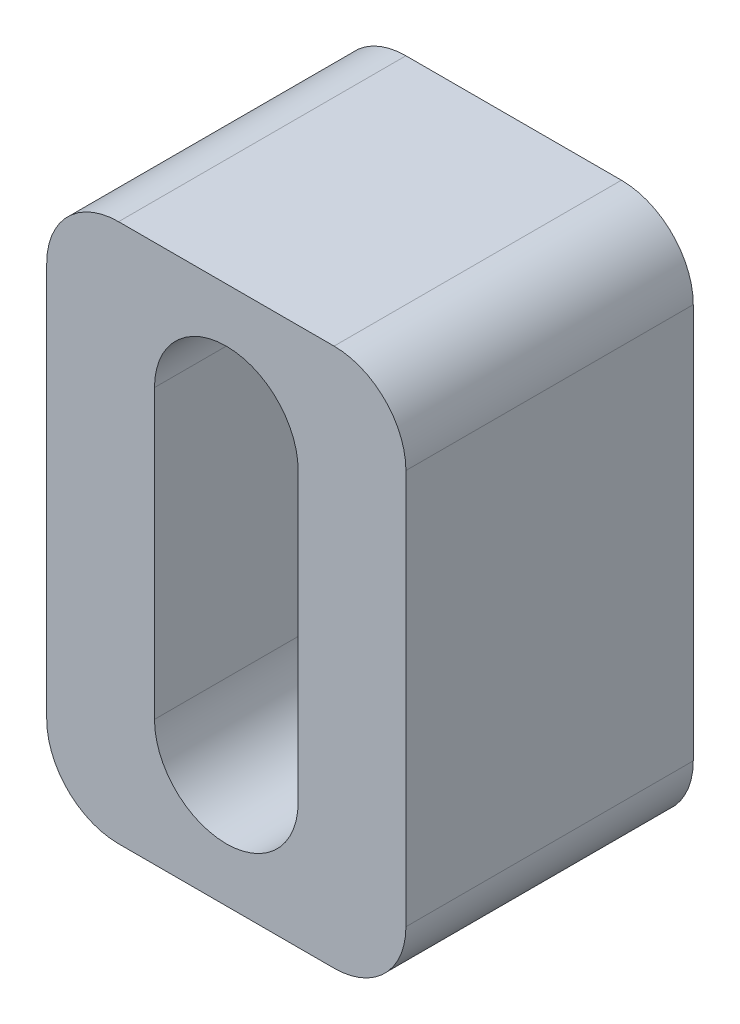
ISO-10303-21;
HEADER;
FILE_DESCRIPTION(('STEP AP214'),'2;1');
FILE_NAME('part.step','',(''),(''),'','','');
FILE_SCHEMA(('AUTOMOTIVE_DESIGN { 1 0 10303 214 1 1 1 1 }'));
ENDSEC;
DATA;
#1=APPLICATION_CONTEXT('core data for automotive mechanical design processes');
#2=APPLICATION_PROTOCOL_DEFINITION('international standard','automotive_design',2000,#1);
#3=PRODUCT_CONTEXT('',#1,'mechanical');
#4=PRODUCT('Part','Part','',(#3));
#5=PRODUCT_RELATED_PRODUCT_CATEGORY('part','',(#4));
#6=PRODUCT_DEFINITION_FORMATION('','',#4);
#7=PRODUCT_DEFINITION_CONTEXT('part definition',#1,'design');
#8=PRODUCT_DEFINITION('design','',#6,#7);
#9=PRODUCT_DEFINITION_SHAPE('','',#8);
#10=(LENGTH_UNIT() NAMED_UNIT(*) SI_UNIT(.MILLI.,.METRE.));
#11=(NAMED_UNIT(*) PLANE_ANGLE_UNIT() SI_UNIT($,.RADIAN.));
#12=(NAMED_UNIT(*) SI_UNIT($,.STERADIAN.) SOLID_ANGLE_UNIT());
#13=UNCERTAINTY_MEASURE_WITH_UNIT(LENGTH_MEASURE(1.E-05),#10,'distance_accuracy_value','');
#14=(GEOMETRIC_REPRESENTATION_CONTEXT(3) GLOBAL_UNCERTAINTY_ASSIGNED_CONTEXT((#13)) GLOBAL_UNIT_ASSIGNED_CONTEXT((#10,
#11,#12)) REPRESENTATION_CONTEXT('',''));
#15=CARTESIAN_POINT('',(0.,0.,0.));
#16=DIRECTION('',(0.,0.,1.));
#17=DIRECTION('',(1.,0.,0.));
#18=AXIS2_PLACEMENT_3D('',#15,#16,#17);
#19=CARTESIAN_POINT('',(0.,0.,8.));
#20=DIRECTION('',(0.,0.,-1.));
#21=DIRECTION('',(-1.,0.,0.));
#22=AXIS2_PLACEMENT_3D('',#19,#20,#21);
#23=PLANE('',#22);
#24=DIRECTION('',(0.,-1.,0.));
#25=VECTOR('',#24,1.);
#26=CARTESIAN_POINT('',(0.,0.,8.));
#27=LINE('',#26,#25);
#28=CARTESIAN_POINT('',(0.,13.,8.));
#29=VERTEX_POINT('',#28);
#30=CARTESIAN_POINT('',(0.,2.,8.));
#31=VERTEX_POINT('',#30);
#32=EDGE_CURVE('E165',#29,#31,#27,.T.);
#33=ORIENTED_EDGE('',*,*,#32,.T.);
#34=CARTESIAN_POINT('',(2.,2.,8.));
#35=DIRECTION('',(0.,0.,-1.));
#36=DIRECTION('',(-1.,0.,0.));
#37=AXIS2_PLACEMENT_3D('',#34,#35,#36);
#38=CIRCLE('',#37,2.);
#39=CARTESIAN_POINT('',(2.,0.,8.));
#40=VERTEX_POINT('',#39);
#41=EDGE_CURVE('E208',#31,#40,#38,.F.);
#42=ORIENTED_EDGE('',*,*,#41,.T.);
#43=DIRECTION('',(1.,0.,0.));
#44=VECTOR('',#43,1.);
#45=CARTESIAN_POINT('',(0.,0.,8.));
#46=LINE('',#45,#44);
#47=CARTESIAN_POINT('',(8.,0.,8.));
#48=VERTEX_POINT('',#47);
#49=EDGE_CURVE('E168',#40,#48,#46,.T.);
#50=ORIENTED_EDGE('',*,*,#49,.T.);
#51=CARTESIAN_POINT('',(8.,2.,8.));
#52=DIRECTION('',(0.,0.,-1.));
#53=DIRECTION('',(-1.,0.,0.));
#54=AXIS2_PLACEMENT_3D('',#51,#52,#53);
#55=CIRCLE('',#54,2.);
#56=CARTESIAN_POINT('',(10.,2.,8.));
#57=VERTEX_POINT('',#56);
#58=EDGE_CURVE('E206',#48,#57,#55,.F.);
#59=ORIENTED_EDGE('',*,*,#58,.T.);
#60=DIRECTION('',(0.,1.,0.));
#61=VECTOR('',#60,1.);
#62=CARTESIAN_POINT('',(10.,0.,8.));
#63=LINE('',#62,#61);
#64=CARTESIAN_POINT('',(10.,13.,8.));
#65=VERTEX_POINT('',#64);
#66=EDGE_CURVE('E172',#57,#65,#63,.T.);
#67=ORIENTED_EDGE('',*,*,#66,.T.);
#68=CARTESIAN_POINT('',(8.,13.,8.));
#69=DIRECTION('',(0.,0.,-1.));
#70=DIRECTION('',(-1.,0.,0.));
#71=AXIS2_PLACEMENT_3D('',#68,#69,#70);
#72=CIRCLE('',#71,2.);
#73=CARTESIAN_POINT('',(8.,15.,8.));
#74=VERTEX_POINT('',#73);
#75=EDGE_CURVE('E54',#65,#74,#72,.F.);
#76=ORIENTED_EDGE('',*,*,#75,.T.);
#77=DIRECTION('',(-1.,0.,0.));
#78=VECTOR('',#77,1.);
#79=CARTESIAN_POINT('',(0.,15.,8.));
#80=LINE('',#79,#78);
#81=CARTESIAN_POINT('',(2.,15.,8.));
#82=VERTEX_POINT('',#81);
#83=EDGE_CURVE('E174',#74,#82,#80,.T.);
#84=ORIENTED_EDGE('',*,*,#83,.T.);
#85=CARTESIAN_POINT('',(2.,13.,8.));
#86=DIRECTION('',(0.,0.,-1.));
#87=DIRECTION('',(-1.,0.,0.));
#88=AXIS2_PLACEMENT_3D('',#85,#86,#87);
#89=CIRCLE('',#88,2.);
#90=EDGE_CURVE('E203',#82,#29,#89,.F.);
#91=ORIENTED_EDGE('',*,*,#90,.T.);
#92=EDGE_LOOP('',(#33,#42,#50,#59,#67,#76,#84,#91));
#93=FACE_BOUND('',#92,.T.);
#94=CARTESIAN_POINT('',(5.,3.5,8.));
#95=DIRECTION('',(0.,0.,1.));
#96=DIRECTION('',(1.,0.,0.));
#97=AXIS2_PLACEMENT_3D('',#94,#95,#96);
#98=CIRCLE('',#97,2.);
#99=CARTESIAN_POINT('',(3.,3.5,8.));
#100=VERTEX_POINT('',#99);
#101=CARTESIAN_POINT('',(7.,3.5,8.));
#102=VERTEX_POINT('',#101);
#103=EDGE_CURVE('E124',#100,#102,#98,.T.);
#104=ORIENTED_EDGE('',*,*,#103,.F.);
#105=DIRECTION('',(0.,-1.,0.));
#106=VECTOR('',#105,1.);
#107=CARTESIAN_POINT('',(3.,3.5,8.));
#108=LINE('',#107,#106);
#109=CARTESIAN_POINT('',(3.,11.5,8.));
#110=VERTEX_POINT('',#109);
#111=EDGE_CURVE('E149',#110,#100,#108,.T.);
#112=ORIENTED_EDGE('',*,*,#111,.F.);
#113=CARTESIAN_POINT('',(5.,11.5,8.));
#114=DIRECTION('',(0.,0.,1.));
#115=DIRECTION('',(1.,0.,0.));
#116=AXIS2_PLACEMENT_3D('',#113,#114,#115);
#117=CIRCLE('',#116,2.);
#118=CARTESIAN_POINT('',(7.,11.5,8.));
#119=VERTEX_POINT('',#118);
#120=EDGE_CURVE('E147',#119,#110,#117,.T.);
#121=ORIENTED_EDGE('',*,*,#120,.F.);
#122=DIRECTION('',(0.,1.,0.));
#123=VECTOR('',#122,1.);
#124=CARTESIAN_POINT('',(7.,3.5,8.));
#125=LINE('',#124,#123);
#126=EDGE_CURVE('E134',#102,#119,#125,.T.);
#127=ORIENTED_EDGE('',*,*,#126,.F.);
#128=EDGE_LOOP('',(#104,#112,#121,#127));
#129=FACE_BOUND('',#128,.T.);
#130=ADVANCED_FACE('F33',(#93,#129),#23,.F.);
#131=CARTESIAN_POINT('',(0.,0.,0.));
#132=DIRECTION('',(0.,0.,-1.));
#133=DIRECTION('',(-1.,0.,0.));
#134=AXIS2_PLACEMENT_3D('',#131,#132,#133);
#135=PLANE('',#134);
#136=DIRECTION('',(1.,0.,0.));
#137=VECTOR('',#136,1.);
#138=CARTESIAN_POINT('',(0.,0.,0.));
#139=LINE('',#138,#137);
#140=CARTESIAN_POINT('',(2.,0.,0.));
#141=VERTEX_POINT('',#140);
#142=CARTESIAN_POINT('',(8.,0.,0.));
#143=VERTEX_POINT('',#142);
#144=EDGE_CURVE('E179',#141,#143,#139,.T.);
#145=ORIENTED_EDGE('',*,*,#144,.F.);
#146=CARTESIAN_POINT('',(2.,2.,0.));
#147=DIRECTION('',(0.,0.,-1.));
#148=DIRECTION('',(-1.,0.,0.));
#149=AXIS2_PLACEMENT_3D('',#146,#147,#148);
#150=CIRCLE('',#149,2.);
#151=CARTESIAN_POINT('',(0.,2.,0.));
#152=VERTEX_POINT('',#151);
#153=EDGE_CURVE('E196',#141,#152,#150,.T.);
#154=ORIENTED_EDGE('',*,*,#153,.T.);
#155=DIRECTION('',(0.,-1.,0.));
#156=VECTOR('',#155,1.);
#157=CARTESIAN_POINT('',(0.,0.,0.));
#158=LINE('',#157,#156);
#159=CARTESIAN_POINT('',(0.,13.,0.));
#160=VERTEX_POINT('',#159);
#161=EDGE_CURVE('E142',#160,#152,#158,.T.);
#162=ORIENTED_EDGE('',*,*,#161,.F.);
#163=CARTESIAN_POINT('',(2.,13.,0.));
#164=DIRECTION('',(0.,0.,-1.));
#165=DIRECTION('',(-1.,0.,0.));
#166=AXIS2_PLACEMENT_3D('',#163,#164,#165);
#167=CIRCLE('',#166,2.);
#168=CARTESIAN_POINT('',(2.,15.,0.));
#169=VERTEX_POINT('',#168);
#170=EDGE_CURVE('E190',#160,#169,#167,.T.);
#171=ORIENTED_EDGE('',*,*,#170,.T.);
#172=DIRECTION('',(-1.,0.,0.));
#173=VECTOR('',#172,1.);
#174=CARTESIAN_POINT('',(0.,15.,0.));
#175=LINE('',#174,#173);
#176=CARTESIAN_POINT('',(8.,15.,0.));
#177=VERTEX_POINT('',#176);
#178=EDGE_CURVE('E169',#177,#169,#175,.T.);
#179=ORIENTED_EDGE('',*,*,#178,.F.);
#180=CARTESIAN_POINT('',(8.,13.,0.));
#181=DIRECTION('',(0.,0.,-1.));
#182=DIRECTION('',(-1.,0.,0.));
#183=AXIS2_PLACEMENT_3D('',#180,#181,#182);
#184=CIRCLE('',#183,2.);
#185=CARTESIAN_POINT('',(10.,13.,0.));
#186=VERTEX_POINT('',#185);
#187=EDGE_CURVE('E192',#177,#186,#184,.T.);
#188=ORIENTED_EDGE('',*,*,#187,.T.);
#189=DIRECTION('',(0.,1.,0.));
#190=VECTOR('',#189,1.);
#191=CARTESIAN_POINT('',(10.,0.,0.));
#192=LINE('',#191,#190);
#193=CARTESIAN_POINT('',(10.,2.,0.));
#194=VERTEX_POINT('',#193);
#195=EDGE_CURVE('E182',#194,#186,#192,.T.);
#196=ORIENTED_EDGE('',*,*,#195,.F.);
#197=CARTESIAN_POINT('',(8.,2.,0.));
#198=DIRECTION('',(0.,0.,-1.));
#199=DIRECTION('',(-1.,0.,0.));
#200=AXIS2_PLACEMENT_3D('',#197,#198,#199);
#201=CIRCLE('',#200,2.);
#202=EDGE_CURVE('E194',#194,#143,#201,.T.);
#203=ORIENTED_EDGE('',*,*,#202,.T.);
#204=EDGE_LOOP('',(#145,#154,#162,#171,#179,#188,#196,#203));
#205=FACE_BOUND('',#204,.T.);
#206=DIRECTION('',(0.,-1.,0.));
#207=VECTOR('',#206,1.);
#208=CARTESIAN_POINT('',(3.,3.5,0.));
#209=LINE('',#208,#207);
#210=CARTESIAN_POINT('',(3.,11.5,0.));
#211=VERTEX_POINT('',#210);
#212=CARTESIAN_POINT('',(3.,3.5,0.));
#213=VERTEX_POINT('',#212);
#214=EDGE_CURVE('E135',#211,#213,#209,.T.);
#215=ORIENTED_EDGE('',*,*,#214,.T.);
#216=CARTESIAN_POINT('',(5.,3.5,0.));
#217=DIRECTION('',(0.,0.,1.));
#218=DIRECTION('',(1.,0.,0.));
#219=AXIS2_PLACEMENT_3D('',#216,#217,#218);
#220=CIRCLE('',#219,2.);
#221=CARTESIAN_POINT('',(7.,3.5,0.));
#222=VERTEX_POINT('',#221);
#223=EDGE_CURVE('E153',#213,#222,#220,.T.);
#224=ORIENTED_EDGE('',*,*,#223,.T.);
#225=DIRECTION('',(0.,1.,0.));
#226=VECTOR('',#225,1.);
#227=CARTESIAN_POINT('',(7.,3.5,0.));
#228=LINE('',#227,#226);
#229=CARTESIAN_POINT('',(7.,11.5,0.));
#230=VERTEX_POINT('',#229);
#231=EDGE_CURVE('E141',#222,#230,#228,.T.);
#232=ORIENTED_EDGE('',*,*,#231,.T.);
#233=CARTESIAN_POINT('',(5.,11.5,0.));
#234=DIRECTION('',(0.,0.,1.));
#235=DIRECTION('',(1.,0.,0.));
#236=AXIS2_PLACEMENT_3D('',#233,#234,#235);
#237=CIRCLE('',#236,2.);
#238=EDGE_CURVE('E156',#230,#211,#237,.T.);
#239=ORIENTED_EDGE('',*,*,#238,.T.);
#240=EDGE_LOOP('',(#215,#224,#232,#239));
#241=FACE_BOUND('',#240,.T.);
#242=ADVANCED_FACE('F224',(#205,#241),#135,.T.);
#243=CARTESIAN_POINT('',(0.,0.,8.));
#244=DIRECTION('',(1.,0.,0.));
#245=DIRECTION('',(0.,0.,-1.));
#246=AXIS2_PLACEMENT_3D('',#243,#244,#245);
#247=PLANE('',#246);
#248=ORIENTED_EDGE('',*,*,#161,.T.);
#249=DIRECTION('',(0.,0.,-1.));
#250=VECTOR('',#249,1.);
#251=CARTESIAN_POINT('',(0.,2.,8.));
#252=LINE('',#251,#250);
#253=EDGE_CURVE('E201',#152,#31,#252,.F.);
#254=ORIENTED_EDGE('',*,*,#253,.T.);
#255=ORIENTED_EDGE('',*,*,#32,.F.);
#256=DIRECTION('',(0.,0.,-1.));
#257=VECTOR('',#256,1.);
#258=CARTESIAN_POINT('',(0.,13.,8.));
#259=LINE('',#258,#257);
#260=EDGE_CURVE('E198',#29,#160,#259,.T.);
#261=ORIENTED_EDGE('',*,*,#260,.T.);
#262=EDGE_LOOP('',(#248,#254,#255,#261));
#263=FACE_BOUND('',#262,.T.);
#264=ADVANCED_FACE('F237',(#263),#247,.F.);
#265=CARTESIAN_POINT('',(0.,0.,8.));
#266=DIRECTION('',(0.,1.,0.));
#267=DIRECTION('',(0.,0.,1.));
#268=AXIS2_PLACEMENT_3D('',#265,#266,#267);
#269=PLANE('',#268);
#270=ORIENTED_EDGE('',*,*,#49,.F.);
#271=DIRECTION('',(0.,0.,-1.));
#272=VECTOR('',#271,1.);
#273=CARTESIAN_POINT('',(2.,0.,8.));
#274=LINE('',#273,#272);
#275=EDGE_CURVE('E187',#40,#141,#274,.T.);
#276=ORIENTED_EDGE('',*,*,#275,.T.);
#277=ORIENTED_EDGE('',*,*,#144,.T.);
#278=DIRECTION('',(0.,0.,-1.));
#279=VECTOR('',#278,1.);
#280=CARTESIAN_POINT('',(8.,0.,8.));
#281=LINE('',#280,#279);
#282=EDGE_CURVE('E176',#143,#48,#281,.F.);
#283=ORIENTED_EDGE('',*,*,#282,.T.);
#284=EDGE_LOOP('',(#270,#276,#277,#283));
#285=FACE_BOUND('',#284,.T.);
#286=ADVANCED_FACE('F245',(#285),#269,.F.);
#287=CARTESIAN_POINT('',(10.,0.,8.));
#288=DIRECTION('',(-1.,0.,0.));
#289=DIRECTION('',(0.,0.,1.));
#290=AXIS2_PLACEMENT_3D('',#287,#288,#289);
#291=PLANE('',#290);
#292=ORIENTED_EDGE('',*,*,#66,.F.);
#293=DIRECTION('',(0.,0.,-1.));
#294=VECTOR('',#293,1.);
#295=CARTESIAN_POINT('',(10.,2.,8.));
#296=LINE('',#295,#294);
#297=EDGE_CURVE('E212',#57,#194,#296,.T.);
#298=ORIENTED_EDGE('',*,*,#297,.T.);
#299=ORIENTED_EDGE('',*,*,#195,.T.);
#300=DIRECTION('',(0.,0.,-1.));
#301=VECTOR('',#300,1.);
#302=CARTESIAN_POINT('',(10.,13.,8.));
#303=LINE('',#302,#301);
#304=EDGE_CURVE('E210',#186,#65,#303,.F.);
#305=ORIENTED_EDGE('',*,*,#304,.T.);
#306=EDGE_LOOP('',(#292,#298,#299,#305));
#307=FACE_BOUND('',#306,.T.);
#308=ADVANCED_FACE('F218',(#307),#291,.F.);
#309=CARTESIAN_POINT('',(0.,15.,8.));
#310=DIRECTION('',(0.,-1.,0.));
#311=DIRECTION('',(0.,0.,-1.));
#312=AXIS2_PLACEMENT_3D('',#309,#310,#311);
#313=PLANE('',#312);
#314=ORIENTED_EDGE('',*,*,#83,.F.);
#315=DIRECTION('',(0.,0.,-1.));
#316=VECTOR('',#315,1.);
#317=CARTESIAN_POINT('',(8.,15.,8.));
#318=LINE('',#317,#316);
#319=EDGE_CURVE('E11',#74,#177,#318,.T.);
#320=ORIENTED_EDGE('',*,*,#319,.T.);
#321=ORIENTED_EDGE('',*,*,#178,.T.);
#322=DIRECTION('',(0.,0.,-1.));
#323=VECTOR('',#322,1.);
#324=CARTESIAN_POINT('',(2.,15.,8.));
#325=LINE('',#324,#323);
#326=EDGE_CURVE('E41',#169,#82,#325,.F.);
#327=ORIENTED_EDGE('',*,*,#326,.T.);
#328=EDGE_LOOP('',(#314,#320,#321,#327));
#329=FACE_BOUND('',#328,.T.);
#330=ADVANCED_FACE('F230',(#329),#313,.F.);
#331=CARTESIAN_POINT('',(5.,3.5,8.));
#332=DIRECTION('',(0.,0.,-1.));
#333=DIRECTION('',(-1.,0.,0.));
#334=AXIS2_PLACEMENT_3D('',#331,#332,#333);
#335=CYLINDRICAL_SURFACE('',#334,2.);
#336=ORIENTED_EDGE('',*,*,#223,.F.);
#337=DIRECTION('',(0.,0.,-1.));
#338=VECTOR('',#337,1.);
#339=CARTESIAN_POINT('',(3.,3.5,8.));
#340=LINE('',#339,#338);
#341=EDGE_CURVE('E130',#100,#213,#340,.T.);
#342=ORIENTED_EDGE('',*,*,#341,.F.);
#343=ORIENTED_EDGE('',*,*,#103,.T.);
#344=DIRECTION('',(0.,0.,-1.));
#345=VECTOR('',#344,1.);
#346=CARTESIAN_POINT('',(7.,3.5,8.));
#347=LINE('',#346,#345);
#348=EDGE_CURVE('E127',#102,#222,#347,.T.);
#349=ORIENTED_EDGE('',*,*,#348,.T.);
#350=EDGE_LOOP('',(#336,#342,#343,#349));
#351=FACE_BOUND('',#350,.T.);
#352=ADVANCED_FACE('F126',(#351),#335,.F.);
#353=CARTESIAN_POINT('',(7.,3.5,8.));
#354=DIRECTION('',(-1.,0.,0.));
#355=DIRECTION('',(0.,0.,1.));
#356=AXIS2_PLACEMENT_3D('',#353,#354,#355);
#357=PLANE('',#356);
#358=ORIENTED_EDGE('',*,*,#231,.F.);
#359=ORIENTED_EDGE('',*,*,#348,.F.);
#360=ORIENTED_EDGE('',*,*,#126,.T.);
#361=DIRECTION('',(0.,0.,-1.));
#362=VECTOR('',#361,1.);
#363=CARTESIAN_POINT('',(7.,11.5,8.));
#364=LINE('',#363,#362);
#365=EDGE_CURVE('E143',#119,#230,#364,.T.);
#366=ORIENTED_EDGE('',*,*,#365,.T.);
#367=EDGE_LOOP('',(#358,#359,#360,#366));
#368=FACE_BOUND('',#367,.T.);
#369=ADVANCED_FACE('F138',(#368),#357,.T.);
#370=CARTESIAN_POINT('',(5.,11.5,8.));
#371=DIRECTION('',(0.,0.,-1.));
#372=DIRECTION('',(-1.,0.,0.));
#373=AXIS2_PLACEMENT_3D('',#370,#371,#372);
#374=CYLINDRICAL_SURFACE('',#373,2.);
#375=ORIENTED_EDGE('',*,*,#238,.F.);
#376=ORIENTED_EDGE('',*,*,#365,.F.);
#377=ORIENTED_EDGE('',*,*,#120,.T.);
#378=DIRECTION('',(0.,0.,-1.));
#379=VECTOR('',#378,1.);
#380=CARTESIAN_POINT('',(3.,11.5,8.));
#381=LINE('',#380,#379);
#382=EDGE_CURVE('E162',#110,#211,#381,.T.);
#383=ORIENTED_EDGE('',*,*,#382,.T.);
#384=EDGE_LOOP('',(#375,#376,#377,#383));
#385=FACE_BOUND('',#384,.T.);
#386=ADVANCED_FACE('F300',(#385),#374,.F.);
#387=CARTESIAN_POINT('',(3.,3.5,8.));
#388=DIRECTION('',(1.,0.,0.));
#389=DIRECTION('',(0.,0.,-1.));
#390=AXIS2_PLACEMENT_3D('',#387,#388,#389);
#391=PLANE('',#390);
#392=ORIENTED_EDGE('',*,*,#214,.F.);
#393=ORIENTED_EDGE('',*,*,#382,.F.);
#394=ORIENTED_EDGE('',*,*,#111,.T.);
#395=ORIENTED_EDGE('',*,*,#341,.T.);
#396=EDGE_LOOP('',(#392,#393,#394,#395));
#397=FACE_BOUND('',#396,.T.);
#398=ADVANCED_FACE('F254',(#397),#391,.T.);
#399=CARTESIAN_POINT('',(2.,2.,8.));
#400=DIRECTION('',(0.,0.,-1.));
#401=DIRECTION('',(-1.,0.,0.));
#402=AXIS2_PLACEMENT_3D('',#399,#400,#401);
#403=CYLINDRICAL_SURFACE('',#402,2.);
#404=ORIENTED_EDGE('',*,*,#41,.F.);
#405=ORIENTED_EDGE('',*,*,#253,.F.);
#406=ORIENTED_EDGE('',*,*,#153,.F.);
#407=ORIENTED_EDGE('',*,*,#275,.F.);
#408=EDGE_LOOP('',(#404,#405,#406,#407));
#409=FACE_BOUND('',#408,.T.);
#410=ADVANCED_FACE('F242',(#409),#403,.T.);
#411=CARTESIAN_POINT('',(8.,2.,8.));
#412=DIRECTION('',(0.,0.,-1.));
#413=DIRECTION('',(-1.,0.,0.));
#414=AXIS2_PLACEMENT_3D('',#411,#412,#413);
#415=CYLINDRICAL_SURFACE('',#414,2.);
#416=ORIENTED_EDGE('',*,*,#58,.F.);
#417=ORIENTED_EDGE('',*,*,#282,.F.);
#418=ORIENTED_EDGE('',*,*,#202,.F.);
#419=ORIENTED_EDGE('',*,*,#297,.F.);
#420=EDGE_LOOP('',(#416,#417,#418,#419));
#421=FACE_BOUND('',#420,.T.);
#422=ADVANCED_FACE('F247',(#421),#415,.T.);
#423=CARTESIAN_POINT('',(8.,13.,8.));
#424=DIRECTION('',(0.,0.,-1.));
#425=DIRECTION('',(-1.,0.,0.));
#426=AXIS2_PLACEMENT_3D('',#423,#424,#425);
#427=CYLINDRICAL_SURFACE('',#426,2.);
#428=ORIENTED_EDGE('',*,*,#75,.F.);
#429=ORIENTED_EDGE('',*,*,#304,.F.);
#430=ORIENTED_EDGE('',*,*,#187,.F.);
#431=ORIENTED_EDGE('',*,*,#319,.F.);
#432=EDGE_LOOP('',(#428,#429,#430,#431));
#433=FACE_BOUND('',#432,.T.);
#434=ADVANCED_FACE('F229',(#433),#427,.T.);
#435=CARTESIAN_POINT('',(2.,13.,8.));
#436=DIRECTION('',(0.,0.,-1.));
#437=DIRECTION('',(-1.,0.,0.));
#438=AXIS2_PLACEMENT_3D('',#435,#436,#437);
#439=CYLINDRICAL_SURFACE('',#438,2.);
#440=ORIENTED_EDGE('',*,*,#90,.F.);
#441=ORIENTED_EDGE('',*,*,#326,.F.);
#442=ORIENTED_EDGE('',*,*,#170,.F.);
#443=ORIENTED_EDGE('',*,*,#260,.F.);
#444=EDGE_LOOP('',(#440,#441,#442,#443));
#445=FACE_BOUND('',#444,.T.);
#446=ADVANCED_FACE('F35',(#445),#439,.T.);
#447=CLOSED_SHELL('',(#130,#242,#264,#286,#308,#330,#352,#369,#386,#398,#410,#422,#434,#446));
#448=MANIFOLD_SOLID_BREP('B2',#447);
#449=ADVANCED_BREP_SHAPE_REPRESENTATION('',(#18,#448),#14);
#450=SHAPE_DEFINITION_REPRESENTATION(#9,#449);
ENDSEC;
END-ISO-10303-21;
